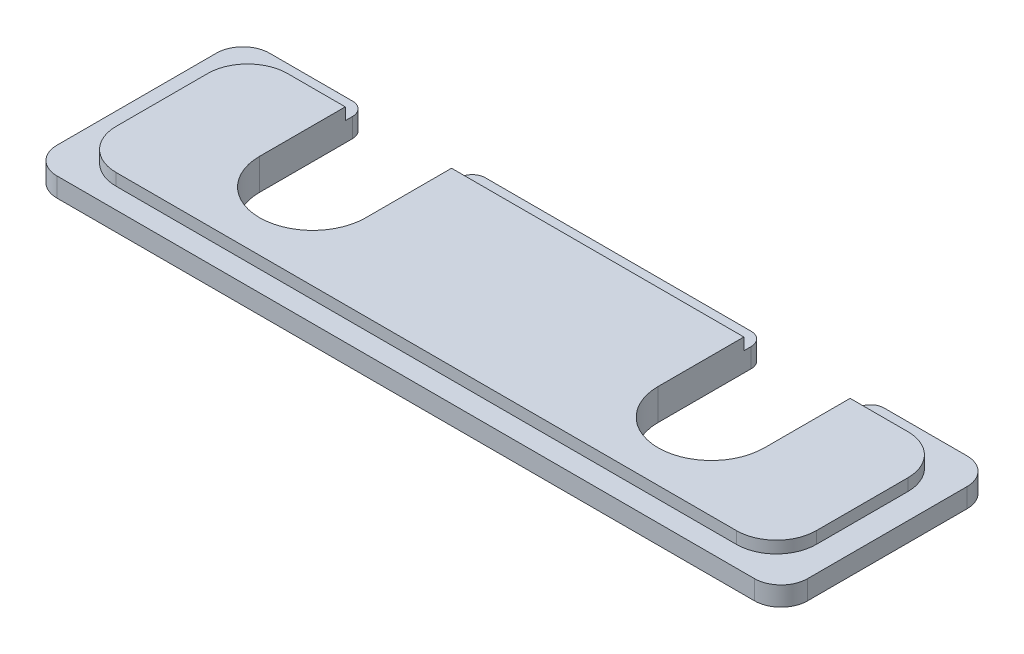
ISO-10303-21;
HEADER;
FILE_DESCRIPTION(('STEP AP214'),'2;1');
FILE_NAME('part.step','',(''),(''),'','','');
FILE_SCHEMA(('AUTOMOTIVE_DESIGN { 1 0 10303 214 1 1 1 1 }'));
ENDSEC;
DATA;
#1=APPLICATION_CONTEXT('core data for automotive mechanical design processes');
#2=APPLICATION_PROTOCOL_DEFINITION('international standard','automotive_design',2000,#1);
#3=PRODUCT_CONTEXT('',#1,'mechanical');
#4=PRODUCT('Part','Part','',(#3));
#5=PRODUCT_RELATED_PRODUCT_CATEGORY('part','',(#4));
#6=PRODUCT_DEFINITION_FORMATION('','',#4);
#7=PRODUCT_DEFINITION_CONTEXT('part definition',#1,'design');
#8=PRODUCT_DEFINITION('design','',#6,#7);
#9=PRODUCT_DEFINITION_SHAPE('','',#8);
#10=(LENGTH_UNIT() NAMED_UNIT(*) SI_UNIT(.MILLI.,.METRE.));
#11=(NAMED_UNIT(*) PLANE_ANGLE_UNIT() SI_UNIT($,.RADIAN.));
#12=(NAMED_UNIT(*) SI_UNIT($,.STERADIAN.) SOLID_ANGLE_UNIT());
#13=UNCERTAINTY_MEASURE_WITH_UNIT(LENGTH_MEASURE(1.E-05),#10,'distance_accuracy_value','');
#14=(GEOMETRIC_REPRESENTATION_CONTEXT(3) GLOBAL_UNCERTAINTY_ASSIGNED_CONTEXT((#13)) GLOBAL_UNIT_ASSIGNED_CONTEXT((#10,
#11,#12)) REPRESENTATION_CONTEXT('',''));
#15=CARTESIAN_POINT('',(0.,0.,0.));
#16=DIRECTION('',(0.,0.,1.));
#17=DIRECTION('',(1.,0.,0.));
#18=AXIS2_PLACEMENT_3D('',#15,#16,#17);
#19=CARTESIAN_POINT('',(26.25,1.45,-6.));
#20=DIRECTION('',(0.,-1.,0.));
#21=DIRECTION('',(0.,0.,-1.));
#22=AXIS2_PLACEMENT_3D('',#19,#20,#21);
#23=PLANE('',#22);
#24=DIRECTION('',(0.,0.,-1.));
#25=VECTOR('',#24,1.);
#26=CARTESIAN_POINT('',(11.,1.45,-6.));
#27=LINE('',#26,#25);
#28=CARTESIAN_POINT('',(11.,1.45,-6.45));
#29=VERTEX_POINT('',#28);
#30=CARTESIAN_POINT('',(11.,1.45,-7.));
#31=VERTEX_POINT('',#30);
#32=EDGE_CURVE('E337',#29,#31,#27,.T.);
#33=ORIENTED_EDGE('',*,*,#32,.T.);
#34=CARTESIAN_POINT('',(10.,1.45,-7.));
#35=DIRECTION('',(0.,-1.,0.));
#36=DIRECTION('',(0.,0.,-1.));
#37=AXIS2_PLACEMENT_3D('',#34,#35,#36);
#38=CIRCLE('',#37,1.);
#39=CARTESIAN_POINT('',(10.,1.45,-8.));
#40=VERTEX_POINT('',#39);
#41=EDGE_CURVE('E559',#31,#40,#38,.F.);
#42=ORIENTED_EDGE('',*,*,#41,.T.);
#43=DIRECTION('',(-1.,0.,0.));
#44=VECTOR('',#43,1.);
#45=CARTESIAN_POINT('',(-26.25,1.45,-8.));
#46=LINE('',#45,#44);
#47=CARTESIAN_POINT('',(-10.,1.45,-8.));
#48=VERTEX_POINT('',#47);
#49=EDGE_CURVE('E447',#40,#48,#46,.T.);
#50=ORIENTED_EDGE('',*,*,#49,.T.);
#51=CARTESIAN_POINT('',(-10.,1.45,-7.));
#52=DIRECTION('',(0.,-1.,0.));
#53=DIRECTION('',(0.,0.,-1.));
#54=AXIS2_PLACEMENT_3D('',#51,#52,#53);
#55=CIRCLE('',#54,1.);
#56=CARTESIAN_POINT('',(-11.,1.45,-7.));
#57=VERTEX_POINT('',#56);
#58=EDGE_CURVE('E54',#48,#57,#55,.F.);
#59=ORIENTED_EDGE('',*,*,#58,.T.);
#60=DIRECTION('',(0.,0.,1.));
#61=VECTOR('',#60,1.);
#62=CARTESIAN_POINT('',(-11.,1.45,-5.99999999999999));
#63=LINE('',#62,#61);
#64=CARTESIAN_POINT('',(-11.,1.45,-6.45));
#65=VERTEX_POINT('',#64);
#66=EDGE_CURVE('E323',#57,#65,#63,.T.);
#67=ORIENTED_EDGE('',*,*,#66,.T.);
#68=DIRECTION('',(-1.,0.,0.));
#69=VECTOR('',#68,1.);
#70=CARTESIAN_POINT('',(-23.35,1.45,-6.45));
#71=LINE('',#70,#69);
#72=EDGE_CURVE('E389',#29,#65,#71,.T.);
#73=ORIENTED_EDGE('',*,*,#72,.F.);
#74=EDGE_LOOP('',(#33,#42,#50,#59,#67,#73));
#75=FACE_BOUND('',#74,.T.);
#76=ADVANCED_FACE('F38',(#75),#23,.F.);
#77=CARTESIAN_POINT('',(-26.25,1.45,-8.));
#78=DIRECTION('',(0.,0.,1.));
#79=DIRECTION('',(1.,0.,0.));
#80=AXIS2_PLACEMENT_3D('',#77,#78,#79);
#81=PLANE('',#80);
#82=ORIENTED_EDGE('',*,*,#49,.F.);
#83=DIRECTION('',(0.,1.,0.));
#84=VECTOR('',#83,1.);
#85=CARTESIAN_POINT('',(10.,1.45,-8.));
#86=LINE('',#85,#84);
#87=CARTESIAN_POINT('',(10.,0.,-8.));
#88=VERTEX_POINT('',#87);
#89=EDGE_CURVE('E565',#40,#88,#86,.F.);
#90=ORIENTED_EDGE('',*,*,#89,.T.);
#91=DIRECTION('',(-1.,0.,0.));
#92=VECTOR('',#91,1.);
#93=CARTESIAN_POINT('',(-26.25,0.,-8.));
#94=LINE('',#93,#92);
#95=CARTESIAN_POINT('',(-10.,0.,-8.));
#96=VERTEX_POINT('',#95);
#97=EDGE_CURVE('E475',#88,#96,#94,.T.);
#98=ORIENTED_EDGE('',*,*,#97,.T.);
#99=DIRECTION('',(0.,1.,0.));
#100=VECTOR('',#99,1.);
#101=CARTESIAN_POINT('',(-10.,1.45,-8.));
#102=LINE('',#101,#100);
#103=EDGE_CURVE('E562',#96,#48,#102,.T.);
#104=ORIENTED_EDGE('',*,*,#103,.T.);
#105=EDGE_LOOP('',(#82,#90,#98,#104));
#106=FACE_BOUND('',#105,.T.);
#107=ADVANCED_FACE('F690',(#106),#81,.F.);
#108=CARTESIAN_POINT('',(26.25,0.,-8.));
#109=VERTEX_POINT('',#108);
#110=CARTESIAN_POINT('',(20.,0.,-8.));
#111=VERTEX_POINT('',#110);
#112=EDGE_CURVE('E470',#109,#111,#94,.T.);
#113=ORIENTED_EDGE('',*,*,#112,.T.);
#114=DIRECTION('',(0.,1.,0.));
#115=VECTOR('',#114,1.);
#116=CARTESIAN_POINT('',(20.,1.45,-8.));
#117=LINE('',#116,#115);
#118=CARTESIAN_POINT('',(20.,1.45,-8.));
#119=VERTEX_POINT('',#118);
#120=EDGE_CURVE('E529',#111,#119,#117,.T.);
#121=ORIENTED_EDGE('',*,*,#120,.T.);
#122=CARTESIAN_POINT('',(26.25,1.45,-8.));
#123=VERTEX_POINT('',#122);
#124=EDGE_CURVE('E442',#123,#119,#46,.T.);
#125=ORIENTED_EDGE('',*,*,#124,.F.);
#126=DIRECTION('',(0.,-1.,0.));
#127=VECTOR('',#126,1.);
#128=CARTESIAN_POINT('',(26.25,1.45,-8.));
#129=LINE('',#128,#127);
#130=EDGE_CURVE('E519',#123,#109,#129,.T.);
#131=ORIENTED_EDGE('',*,*,#130,.T.);
#132=EDGE_LOOP('',(#113,#121,#125,#131));
#133=FACE_BOUND('',#132,.T.);
#134=ADVANCED_FACE('F643',(#133),#81,.F.);
#135=CARTESIAN_POINT('',(-23.35,2.35,-6.45));
#136=DIRECTION('',(0.,0.,1.));
#137=DIRECTION('',(1.,0.,0.));
#138=AXIS2_PLACEMENT_3D('',#135,#136,#137);
#139=PLANE('',#138);
#140=DIRECTION('',(-1.,0.,0.));
#141=VECTOR('',#140,1.);
#142=CARTESIAN_POINT('',(-23.35,2.35,-6.45));
#143=LINE('',#142,#141);
#144=CARTESIAN_POINT('',(11.,2.35,-6.45));
#145=VERTEX_POINT('',#144);
#146=CARTESIAN_POINT('',(-11.,2.35,-6.45));
#147=VERTEX_POINT('',#146);
#148=EDGE_CURVE('E359',#145,#147,#143,.T.);
#149=ORIENTED_EDGE('',*,*,#148,.F.);
#150=DIRECTION('',(0.,-1.,0.));
#151=VECTOR('',#150,1.);
#152=CARTESIAN_POINT('',(11.,2.35,-6.45));
#153=LINE('',#152,#151);
#154=EDGE_CURVE('E333',#145,#29,#153,.T.);
#155=ORIENTED_EDGE('',*,*,#154,.T.);
#156=ORIENTED_EDGE('',*,*,#72,.T.);
#157=DIRECTION('',(0.,1.,0.));
#158=VECTOR('',#157,1.);
#159=CARTESIAN_POINT('',(-11.,2.35,-6.45));
#160=LINE('',#159,#158);
#161=EDGE_CURVE('E319',#65,#147,#160,.T.);
#162=ORIENTED_EDGE('',*,*,#161,.T.);
#163=EDGE_LOOP('',(#149,#155,#156,#162));
#164=FACE_BOUND('',#163,.T.);
#165=ADVANCED_FACE('F592',(#164),#139,.F.);
#166=CARTESIAN_POINT('',(23.35,1.45,-6.45));
#167=VERTEX_POINT('',#166);
#168=CARTESIAN_POINT('',(19.,1.45,-6.45));
#169=VERTEX_POINT('',#168);
#170=EDGE_CURVE('E384',#167,#169,#71,.T.);
#171=ORIENTED_EDGE('',*,*,#170,.T.);
#172=DIRECTION('',(0.,1.,0.));
#173=VECTOR('',#172,1.);
#174=CARTESIAN_POINT('',(19.,2.35,-6.45));
#175=LINE('',#174,#173);
#176=CARTESIAN_POINT('',(19.,2.35,-6.45));
#177=VERTEX_POINT('',#176);
#178=EDGE_CURVE('E326',#169,#177,#175,.T.);
#179=ORIENTED_EDGE('',*,*,#178,.T.);
#180=CARTESIAN_POINT('',(23.35,2.35,-6.45));
#181=VERTEX_POINT('',#180);
#182=EDGE_CURVE('E354',#181,#177,#143,.T.);
#183=ORIENTED_EDGE('',*,*,#182,.F.);
#184=DIRECTION('',(0.,-1.,0.));
#185=VECTOR('',#184,1.);
#186=CARTESIAN_POINT('',(23.35,2.35,-6.45));
#187=LINE('',#186,#185);
#188=EDGE_CURVE('E423',#181,#167,#187,.T.);
#189=ORIENTED_EDGE('',*,*,#188,.T.);
#190=EDGE_LOOP('',(#171,#179,#183,#189));
#191=FACE_BOUND('',#190,.T.);
#192=ADVANCED_FACE('F637',(#191),#139,.F.);
#193=ORIENTED_EDGE('',*,*,#124,.T.);
#194=CARTESIAN_POINT('',(20.,1.45,-7.));
#195=DIRECTION('',(0.,-1.,0.));
#196=DIRECTION('',(0.,0.,-1.));
#197=AXIS2_PLACEMENT_3D('',#194,#195,#196);
#198=CIRCLE('',#197,1.);
#199=CARTESIAN_POINT('',(19.,1.45,-7.));
#200=VERTEX_POINT('',#199);
#201=EDGE_CURVE('E536',#119,#200,#198,.F.);
#202=ORIENTED_EDGE('',*,*,#201,.T.);
#203=DIRECTION('',(0.,0.,1.));
#204=VECTOR('',#203,1.);
#205=CARTESIAN_POINT('',(19.,1.45,-6.));
#206=LINE('',#205,#204);
#207=EDGE_CURVE('E330',#200,#169,#206,.T.);
#208=ORIENTED_EDGE('',*,*,#207,.T.);
#209=ORIENTED_EDGE('',*,*,#170,.F.);
#210=CARTESIAN_POINT('',(23.35,1.45,-3.45));
#211=DIRECTION('',(0.,1.,0.));
#212=DIRECTION('',(0.,0.,-1.));
#213=AXIS2_PLACEMENT_3D('',#210,#211,#212);
#214=CIRCLE('',#213,3.);
#215=CARTESIAN_POINT('',(26.35,1.45,-3.44999999999998));
#216=VERTEX_POINT('',#215);
#217=EDGE_CURVE('E379',#216,#167,#214,.T.);
#218=ORIENTED_EDGE('',*,*,#217,.F.);
#219=DIRECTION('',(0.,0.,-1.));
#220=VECTOR('',#219,1.);
#221=CARTESIAN_POINT('',(26.35,1.45,3.44999999999998));
#222=LINE('',#221,#220);
#223=CARTESIAN_POINT('',(26.35,1.45,3.44999999999998));
#224=VERTEX_POINT('',#223);
#225=EDGE_CURVE('E375',#224,#216,#222,.T.);
#226=ORIENTED_EDGE('',*,*,#225,.F.);
#227=CARTESIAN_POINT('',(23.35,1.45,3.45));
#228=DIRECTION('',(0.,1.,0.));
#229=DIRECTION('',(0.,0.,1.));
#230=AXIS2_PLACEMENT_3D('',#227,#228,#229);
#231=CIRCLE('',#230,3.);
#232=CARTESIAN_POINT('',(23.35,1.45,6.45));
#233=VERTEX_POINT('',#232);
#234=EDGE_CURVE('E341',#233,#224,#231,.T.);
#235=ORIENTED_EDGE('',*,*,#234,.F.);
#236=DIRECTION('',(1.,0.,0.));
#237=VECTOR('',#236,1.);
#238=CARTESIAN_POINT('',(-23.35,1.45,6.45));
#239=LINE('',#238,#237);
#240=CARTESIAN_POINT('',(-23.35,1.45,6.45));
#241=VERTEX_POINT('',#240);
#242=EDGE_CURVE('E347',#241,#233,#239,.T.);
#243=ORIENTED_EDGE('',*,*,#242,.F.);
#244=CARTESIAN_POINT('',(-23.35,1.45,3.45));
#245=DIRECTION('',(0.,1.,0.));
#246=DIRECTION('',(0.,0.,-1.));
#247=AXIS2_PLACEMENT_3D('',#244,#245,#246);
#248=CIRCLE('',#247,3.);
#249=CARTESIAN_POINT('',(-26.35,1.45,3.44999999999998));
#250=VERTEX_POINT('',#249);
#251=EDGE_CURVE('E397',#250,#241,#248,.T.);
#252=ORIENTED_EDGE('',*,*,#251,.F.);
#253=DIRECTION('',(0.,0.,1.));
#254=VECTOR('',#253,1.);
#255=CARTESIAN_POINT('',(-26.35,1.45,3.44999999999998));
#256=LINE('',#255,#254);
#257=CARTESIAN_POINT('',(-26.35,1.45,-3.44999999999998));
#258=VERTEX_POINT('',#257);
#259=EDGE_CURVE('E393',#258,#250,#256,.T.);
#260=ORIENTED_EDGE('',*,*,#259,.F.);
#261=CARTESIAN_POINT('',(-23.35,1.45,-3.45));
#262=DIRECTION('',(0.,1.,0.));
#263=DIRECTION('',(0.,0.,-1.));
#264=AXIS2_PLACEMENT_3D('',#261,#262,#263);
#265=CIRCLE('',#264,3.);
#266=CARTESIAN_POINT('',(-23.35,1.45,-6.45));
#267=VERTEX_POINT('',#266);
#268=EDGE_CURVE('E388',#267,#258,#265,.T.);
#269=ORIENTED_EDGE('',*,*,#268,.F.);
#270=CARTESIAN_POINT('',(-19.,1.45,-6.45));
#271=VERTEX_POINT('',#270);
#272=EDGE_CURVE('E383',#271,#267,#71,.T.);
#273=ORIENTED_EDGE('',*,*,#272,.F.);
#274=DIRECTION('',(0.,0.,-1.));
#275=VECTOR('',#274,1.);
#276=CARTESIAN_POINT('',(-19.,1.45,-6.));
#277=LINE('',#276,#275);
#278=CARTESIAN_POINT('',(-19.,1.45,-7.));
#279=VERTEX_POINT('',#278);
#280=EDGE_CURVE('E315',#271,#279,#277,.T.);
#281=ORIENTED_EDGE('',*,*,#280,.T.);
#282=CARTESIAN_POINT('',(-20.,1.45,-7.));
#283=DIRECTION('',(0.,-1.,0.));
#284=DIRECTION('',(0.,0.,-1.));
#285=AXIS2_PLACEMENT_3D('',#282,#283,#284);
#286=CIRCLE('',#285,1.);
#287=CARTESIAN_POINT('',(-20.,1.45,-8.));
#288=VERTEX_POINT('',#287);
#289=EDGE_CURVE('E533',#279,#288,#286,.F.);
#290=ORIENTED_EDGE('',*,*,#289,.T.);
#291=CARTESIAN_POINT('',(-26.25,1.45,-8.));
#292=VERTEX_POINT('',#291);
#293=EDGE_CURVE('E440',#288,#292,#46,.T.);
#294=ORIENTED_EDGE('',*,*,#293,.T.);
#295=CARTESIAN_POINT('',(-26.25,1.45,-6.));
#296=DIRECTION('',(0.,1.,0.));
#297=DIRECTION('',(0.,0.,-1.));
#298=AXIS2_PLACEMENT_3D('',#295,#296,#297);
#299=CIRCLE('',#298,2.);
#300=CARTESIAN_POINT('',(-28.25,1.45,-6.));
#301=VERTEX_POINT('',#300);
#302=EDGE_CURVE('E446',#292,#301,#299,.T.);
#303=ORIENTED_EDGE('',*,*,#302,.T.);
#304=DIRECTION('',(0.,0.,1.));
#305=VECTOR('',#304,1.);
#306=CARTESIAN_POINT('',(-28.25,1.45,6.));
#307=LINE('',#306,#305);
#308=CARTESIAN_POINT('',(-28.25,1.45,6.));
#309=VERTEX_POINT('',#308);
#310=EDGE_CURVE('E450',#301,#309,#307,.T.);
#311=ORIENTED_EDGE('',*,*,#310,.T.);
#312=CARTESIAN_POINT('',(-26.25,1.45,6.));
#313=DIRECTION('',(0.,1.,0.));
#314=DIRECTION('',(0.,0.,-1.));
#315=AXIS2_PLACEMENT_3D('',#312,#313,#314);
#316=CIRCLE('',#315,2.);
#317=CARTESIAN_POINT('',(-26.25,1.45,8.));
#318=VERTEX_POINT('',#317);
#319=EDGE_CURVE('E453',#309,#318,#316,.T.);
#320=ORIENTED_EDGE('',*,*,#319,.T.);
#321=DIRECTION('',(1.,0.,0.));
#322=VECTOR('',#321,1.);
#323=CARTESIAN_POINT('',(-26.25,1.45,8.));
#324=LINE('',#323,#322);
#325=CARTESIAN_POINT('',(26.25,1.45,8.));
#326=VERTEX_POINT('',#325);
#327=EDGE_CURVE('E456',#318,#326,#324,.T.);
#328=ORIENTED_EDGE('',*,*,#327,.T.);
#329=CARTESIAN_POINT('',(26.25,1.45,6.));
#330=DIRECTION('',(0.,1.,0.));
#331=DIRECTION('',(0.,0.,1.));
#332=AXIS2_PLACEMENT_3D('',#329,#330,#331);
#333=CIRCLE('',#332,2.);
#334=CARTESIAN_POINT('',(28.25,1.45,6.));
#335=VERTEX_POINT('',#334);
#336=EDGE_CURVE('E459',#326,#335,#333,.T.);
#337=ORIENTED_EDGE('',*,*,#336,.T.);
#338=DIRECTION('',(0.,0.,-1.));
#339=VECTOR('',#338,1.);
#340=CARTESIAN_POINT('',(28.25,1.45,6.));
#341=LINE('',#340,#339);
#342=CARTESIAN_POINT('',(28.25,1.45,-6.));
#343=VERTEX_POINT('',#342);
#344=EDGE_CURVE('E462',#335,#343,#341,.T.);
#345=ORIENTED_EDGE('',*,*,#344,.T.);
#346=CARTESIAN_POINT('',(26.25,1.45,-6.));
#347=DIRECTION('',(0.,1.,0.));
#348=DIRECTION('',(0.,0.,-1.));
#349=AXIS2_PLACEMENT_3D('',#346,#347,#348);
#350=CIRCLE('',#349,2.);
#351=EDGE_CURVE('E436',#343,#123,#350,.T.);
#352=ORIENTED_EDGE('',*,*,#351,.T.);
#353=EDGE_LOOP('',(#193,#202,#208,#209,#218,#226,#235,#243,#252,#260,#269,#273,#281,#290,#294,
#303,#311,#320,#328,#337,#345,#352));
#354=FACE_BOUND('',#353,.T.);
#355=ADVANCED_FACE('F581',(#354),#23,.F.);
#356=CARTESIAN_POINT('',(26.25,1.45,-6.));
#357=DIRECTION('',(0.,-1.,0.));
#358=DIRECTION('',(0.,0.,-1.));
#359=AXIS2_PLACEMENT_3D('',#356,#357,#358);
#360=CYLINDRICAL_SURFACE('',#359,2.);
#361=CARTESIAN_POINT('',(26.25,0.,-6.));
#362=DIRECTION('',(0.,1.,0.));
#363=DIRECTION('',(0.,0.,-1.));
#364=AXIS2_PLACEMENT_3D('',#361,#362,#363);
#365=CIRCLE('',#364,2.);
#366=CARTESIAN_POINT('',(28.25,0.,-6.));
#367=VERTEX_POINT('',#366);
#368=EDGE_CURVE('E435',#367,#109,#365,.T.);
#369=ORIENTED_EDGE('',*,*,#368,.T.);
#370=ORIENTED_EDGE('',*,*,#130,.F.);
#371=ORIENTED_EDGE('',*,*,#351,.F.);
#372=DIRECTION('',(0.,-1.,0.));
#373=VECTOR('',#372,1.);
#374=CARTESIAN_POINT('',(28.25,1.45,-6.));
#375=LINE('',#374,#373);
#376=EDGE_CURVE('E465',#343,#367,#375,.T.);
#377=ORIENTED_EDGE('',*,*,#376,.T.);
#378=EDGE_LOOP('',(#369,#370,#371,#377));
#379=FACE_BOUND('',#378,.T.);
#380=ADVANCED_FACE('F649',(#379),#360,.T.);
#381=ORIENTED_EDGE('',*,*,#293,.F.);
#382=DIRECTION('',(0.,1.,0.));
#383=VECTOR('',#382,1.);
#384=CARTESIAN_POINT('',(-20.,1.45,-8.));
#385=LINE('',#384,#383);
#386=CARTESIAN_POINT('',(-20.,0.,-8.));
#387=VERTEX_POINT('',#386);
#388=EDGE_CURVE('E11',#288,#387,#385,.F.);
#389=ORIENTED_EDGE('',*,*,#388,.T.);
#390=CARTESIAN_POINT('',(-26.25,0.,-8.));
#391=VERTEX_POINT('',#390);
#392=EDGE_CURVE('E469',#387,#391,#94,.T.);
#393=ORIENTED_EDGE('',*,*,#392,.T.);
#394=DIRECTION('',(0.,-1.,0.));
#395=VECTOR('',#394,1.);
#396=CARTESIAN_POINT('',(-26.25,1.45,-8.));
#397=LINE('',#396,#395);
#398=EDGE_CURVE('E515',#292,#391,#397,.T.);
#399=ORIENTED_EDGE('',*,*,#398,.F.);
#400=EDGE_LOOP('',(#381,#389,#393,#399));
#401=FACE_BOUND('',#400,.T.);
#402=ADVANCED_FACE('F682',(#401),#81,.F.);
#403=CARTESIAN_POINT('',(-26.25,1.45,-6.));
#404=DIRECTION('',(0.,-1.,0.));
#405=DIRECTION('',(0.,0.,-1.));
#406=AXIS2_PLACEMENT_3D('',#403,#404,#405);
#407=CYLINDRICAL_SURFACE('',#406,2.);
#408=CARTESIAN_POINT('',(-26.25,0.,-6.));
#409=DIRECTION('',(0.,1.,0.));
#410=DIRECTION('',(0.,0.,-1.));
#411=AXIS2_PLACEMENT_3D('',#408,#409,#410);
#412=CIRCLE('',#411,2.);
#413=CARTESIAN_POINT('',(-28.25,0.,-6.));
#414=VERTEX_POINT('',#413);
#415=EDGE_CURVE('E474',#391,#414,#412,.T.);
#416=ORIENTED_EDGE('',*,*,#415,.T.);
#417=DIRECTION('',(0.,-1.,0.));
#418=VECTOR('',#417,1.);
#419=CARTESIAN_POINT('',(-28.25,1.45,-6.));
#420=LINE('',#419,#418);
#421=EDGE_CURVE('E511',#301,#414,#420,.T.);
#422=ORIENTED_EDGE('',*,*,#421,.F.);
#423=ORIENTED_EDGE('',*,*,#302,.F.);
#424=ORIENTED_EDGE('',*,*,#398,.T.);
#425=EDGE_LOOP('',(#416,#422,#423,#424));
#426=FACE_BOUND('',#425,.T.);
#427=ADVANCED_FACE('F678',(#426),#407,.T.);
#428=CARTESIAN_POINT('',(-28.25,1.45,6.));
#429=DIRECTION('',(1.,0.,0.));
#430=DIRECTION('',(0.,0.,-1.));
#431=AXIS2_PLACEMENT_3D('',#428,#429,#430);
#432=PLANE('',#431);
#433=DIRECTION('',(0.,0.,1.));
#434=VECTOR('',#433,1.);
#435=CARTESIAN_POINT('',(-28.25,0.,6.));
#436=LINE('',#435,#434);
#437=CARTESIAN_POINT('',(-28.25,0.,6.));
#438=VERTEX_POINT('',#437);
#439=EDGE_CURVE('E478',#414,#438,#436,.T.);
#440=ORIENTED_EDGE('',*,*,#439,.T.);
#441=DIRECTION('',(0.,-1.,0.));
#442=VECTOR('',#441,1.);
#443=CARTESIAN_POINT('',(-28.25,1.45,6.));
#444=LINE('',#443,#442);
#445=EDGE_CURVE('E507',#309,#438,#444,.T.);
#446=ORIENTED_EDGE('',*,*,#445,.F.);
#447=ORIENTED_EDGE('',*,*,#310,.F.);
#448=ORIENTED_EDGE('',*,*,#421,.T.);
#449=EDGE_LOOP('',(#440,#446,#447,#448));
#450=FACE_BOUND('',#449,.T.);
#451=ADVANCED_FACE('F673',(#450),#432,.F.);
#452=CARTESIAN_POINT('',(-26.25,1.45,6.));
#453=DIRECTION('',(0.,-1.,0.));
#454=DIRECTION('',(0.,0.,-1.));
#455=AXIS2_PLACEMENT_3D('',#452,#453,#454);
#456=CYLINDRICAL_SURFACE('',#455,2.);
#457=CARTESIAN_POINT('',(-26.25,0.,6.));
#458=DIRECTION('',(0.,1.,0.));
#459=DIRECTION('',(0.,0.,-1.));
#460=AXIS2_PLACEMENT_3D('',#457,#458,#459);
#461=CIRCLE('',#460,2.);
#462=CARTESIAN_POINT('',(-26.25,0.,8.));
#463=VERTEX_POINT('',#462);
#464=EDGE_CURVE('E481',#438,#463,#461,.T.);
#465=ORIENTED_EDGE('',*,*,#464,.T.);
#466=DIRECTION('',(0.,-1.,0.));
#467=VECTOR('',#466,1.);
#468=CARTESIAN_POINT('',(-26.25,1.45,8.));
#469=LINE('',#468,#467);
#470=EDGE_CURVE('E503',#318,#463,#469,.T.);
#471=ORIENTED_EDGE('',*,*,#470,.F.);
#472=ORIENTED_EDGE('',*,*,#319,.F.);
#473=ORIENTED_EDGE('',*,*,#445,.T.);
#474=EDGE_LOOP('',(#465,#471,#472,#473));
#475=FACE_BOUND('',#474,.T.);
#476=ADVANCED_FACE('F669',(#475),#456,.T.);
#477=CARTESIAN_POINT('',(-26.25,1.45,8.));
#478=DIRECTION('',(0.,0.,-1.));
#479=DIRECTION('',(-1.,0.,0.));
#480=AXIS2_PLACEMENT_3D('',#477,#478,#479);
#481=PLANE('',#480);
#482=DIRECTION('',(1.,0.,0.));
#483=VECTOR('',#482,1.);
#484=CARTESIAN_POINT('',(-26.25,0.,8.));
#485=LINE('',#484,#483);
#486=CARTESIAN_POINT('',(26.25,0.,8.));
#487=VERTEX_POINT('',#486);
#488=EDGE_CURVE('E484',#463,#487,#485,.T.);
#489=ORIENTED_EDGE('',*,*,#488,.T.);
#490=DIRECTION('',(0.,-1.,0.));
#491=VECTOR('',#490,1.);
#492=CARTESIAN_POINT('',(26.25,1.45,8.));
#493=LINE('',#492,#491);
#494=EDGE_CURVE('E499',#326,#487,#493,.T.);
#495=ORIENTED_EDGE('',*,*,#494,.F.);
#496=ORIENTED_EDGE('',*,*,#327,.F.);
#497=ORIENTED_EDGE('',*,*,#470,.T.);
#498=EDGE_LOOP('',(#489,#495,#496,#497));
#499=FACE_BOUND('',#498,.T.);
#500=ADVANCED_FACE('F664',(#499),#481,.F.);
#501=CARTESIAN_POINT('',(26.25,1.45,6.));
#502=DIRECTION('',(0.,-1.,0.));
#503=DIRECTION('',(0.,0.,-1.));
#504=AXIS2_PLACEMENT_3D('',#501,#502,#503);
#505=CYLINDRICAL_SURFACE('',#504,2.);
#506=CARTESIAN_POINT('',(26.25,0.,6.));
#507=DIRECTION('',(0.,1.,0.));
#508=DIRECTION('',(0.,0.,1.));
#509=AXIS2_PLACEMENT_3D('',#506,#507,#508);
#510=CIRCLE('',#509,2.);
#511=CARTESIAN_POINT('',(28.25,0.,6.));
#512=VERTEX_POINT('',#511);
#513=EDGE_CURVE('E487',#487,#512,#510,.T.);
#514=ORIENTED_EDGE('',*,*,#513,.T.);
#515=DIRECTION('',(0.,-1.,0.));
#516=VECTOR('',#515,1.);
#517=CARTESIAN_POINT('',(28.25,1.45,6.));
#518=LINE('',#517,#516);
#519=EDGE_CURVE('E495',#335,#512,#518,.T.);
#520=ORIENTED_EDGE('',*,*,#519,.F.);
#521=ORIENTED_EDGE('',*,*,#336,.F.);
#522=ORIENTED_EDGE('',*,*,#494,.T.);
#523=EDGE_LOOP('',(#514,#520,#521,#522));
#524=FACE_BOUND('',#523,.T.);
#525=ADVANCED_FACE('F658',(#524),#505,.T.);
#526=CARTESIAN_POINT('',(28.25,1.45,6.));
#527=DIRECTION('',(-1.,0.,0.));
#528=DIRECTION('',(0.,0.,1.));
#529=AXIS2_PLACEMENT_3D('',#526,#527,#528);
#530=PLANE('',#529);
#531=DIRECTION('',(0.,0.,-1.));
#532=VECTOR('',#531,1.);
#533=CARTESIAN_POINT('',(28.25,0.,6.));
#534=LINE('',#533,#532);
#535=EDGE_CURVE('E441',#512,#367,#534,.T.);
#536=ORIENTED_EDGE('',*,*,#535,.T.);
#537=ORIENTED_EDGE('',*,*,#376,.F.);
#538=ORIENTED_EDGE('',*,*,#344,.F.);
#539=ORIENTED_EDGE('',*,*,#519,.T.);
#540=EDGE_LOOP('',(#536,#537,#538,#539));
#541=FACE_BOUND('',#540,.T.);
#542=ADVANCED_FACE('F654',(#541),#530,.F.);
#543=CARTESIAN_POINT('',(26.25,0.,-6.));
#544=DIRECTION('',(0.,-1.,0.));
#545=DIRECTION('',(0.,0.,-1.));
#546=AXIS2_PLACEMENT_3D('',#543,#544,#545);
#547=PLANE('',#546);
#548=DIRECTION('',(0.,0.,-1.));
#549=VECTOR('',#548,1.);
#550=CARTESIAN_POINT('',(19.,0.,-8.));
#551=LINE('',#550,#549);
#552=CARTESIAN_POINT('',(19.,0.,0.));
#553=VERTEX_POINT('',#552);
#554=CARTESIAN_POINT('',(19.,0.,-7.));
#555=VERTEX_POINT('',#554);
#556=EDGE_CURVE('E262',#553,#555,#551,.T.);
#557=ORIENTED_EDGE('',*,*,#556,.T.);
#558=CARTESIAN_POINT('',(20.,0.,-7.));
#559=DIRECTION('',(0.,-1.,0.));
#560=DIRECTION('',(0.,0.,-1.));
#561=AXIS2_PLACEMENT_3D('',#558,#559,#560);
#562=CIRCLE('',#561,1.);
#563=EDGE_CURVE('E550',#555,#111,#562,.T.);
#564=ORIENTED_EDGE('',*,*,#563,.T.);
#565=ORIENTED_EDGE('',*,*,#112,.F.);
#566=ORIENTED_EDGE('',*,*,#368,.F.);
#567=ORIENTED_EDGE('',*,*,#535,.F.);
#568=ORIENTED_EDGE('',*,*,#513,.F.);
#569=ORIENTED_EDGE('',*,*,#488,.F.);
#570=ORIENTED_EDGE('',*,*,#464,.F.);
#571=ORIENTED_EDGE('',*,*,#439,.F.);
#572=ORIENTED_EDGE('',*,*,#415,.F.);
#573=ORIENTED_EDGE('',*,*,#392,.F.);
#574=CARTESIAN_POINT('',(-20.,0.,-7.));
#575=DIRECTION('',(0.,-1.,0.));
#576=DIRECTION('',(0.,0.,-1.));
#577=AXIS2_PLACEMENT_3D('',#574,#575,#576);
#578=CIRCLE('',#577,1.);
#579=CARTESIAN_POINT('',(-19.,0.,-7.));
#580=VERTEX_POINT('',#579);
#581=EDGE_CURVE('E541',#387,#580,#578,.T.);
#582=ORIENTED_EDGE('',*,*,#581,.T.);
#583=DIRECTION('',(0.,0.,1.));
#584=VECTOR('',#583,1.);
#585=CARTESIAN_POINT('',(-19.,0.,0.));
#586=LINE('',#585,#584);
#587=CARTESIAN_POINT('',(-19.,0.,0.));
#588=VERTEX_POINT('',#587);
#589=EDGE_CURVE('E292',#580,#588,#586,.T.);
#590=ORIENTED_EDGE('',*,*,#589,.T.);
#591=CARTESIAN_POINT('',(-15.,0.,0.));
#592=DIRECTION('',(0.,1.,0.));
#593=DIRECTION('',(0.,0.,1.));
#594=AXIS2_PLACEMENT_3D('',#591,#592,#593);
#595=CIRCLE('',#594,4.);
#596=CARTESIAN_POINT('',(-11.,0.,0.));
#597=VERTEX_POINT('',#596);
#598=EDGE_CURVE('E296',#588,#597,#595,.T.);
#599=ORIENTED_EDGE('',*,*,#598,.T.);
#600=DIRECTION('',(0.,0.,-1.));
#601=VECTOR('',#600,1.);
#602=CARTESIAN_POINT('',(-11.,0.,-8.));
#603=LINE('',#602,#601);
#604=CARTESIAN_POINT('',(-11.,0.,-7.));
#605=VERTEX_POINT('',#604);
#606=EDGE_CURVE('E288',#597,#605,#603,.T.);
#607=ORIENTED_EDGE('',*,*,#606,.T.);
#608=CARTESIAN_POINT('',(-10.,0.,-7.));
#609=DIRECTION('',(0.,-1.,0.));
#610=DIRECTION('',(0.,0.,-1.));
#611=AXIS2_PLACEMENT_3D('',#608,#609,#610);
#612=CIRCLE('',#611,1.);
#613=EDGE_CURVE('E544',#605,#96,#612,.T.);
#614=ORIENTED_EDGE('',*,*,#613,.T.);
#615=ORIENTED_EDGE('',*,*,#97,.F.);
#616=CARTESIAN_POINT('',(10.,0.,-7.));
#617=DIRECTION('',(0.,-1.,0.));
#618=DIRECTION('',(0.,0.,-1.));
#619=AXIS2_PLACEMENT_3D('',#616,#617,#618);
#620=CIRCLE('',#619,1.);
#621=CARTESIAN_POINT('',(11.,0.,-7.));
#622=VERTEX_POINT('',#621);
#623=EDGE_CURVE('E547',#88,#622,#620,.T.);
#624=ORIENTED_EDGE('',*,*,#623,.T.);
#625=DIRECTION('',(0.,0.,1.));
#626=VECTOR('',#625,1.);
#627=CARTESIAN_POINT('',(11.,0.,0.));
#628=LINE('',#627,#626);
#629=CARTESIAN_POINT('',(11.,0.,0.));
#630=VERTEX_POINT('',#629);
#631=EDGE_CURVE('E259',#622,#630,#628,.T.);
#632=ORIENTED_EDGE('',*,*,#631,.T.);
#633=CARTESIAN_POINT('',(15.,0.,0.));
#634=DIRECTION('',(0.,1.,0.));
#635=DIRECTION('',(0.,0.,1.));
#636=AXIS2_PLACEMENT_3D('',#633,#634,#635);
#637=CIRCLE('',#636,4.);
#638=EDGE_CURVE('E252',#630,#553,#637,.T.);
#639=ORIENTED_EDGE('',*,*,#638,.T.);
#640=EDGE_LOOP('',(#557,#564,#565,#566,#567,#568,#569,#570,#571,#572,#573,#582,#590,#599,#607,
#614,#615,#624,#632,#639));
#641=FACE_BOUND('',#640,.T.);
#642=ADVANCED_FACE('F271',(#641),#547,.T.);
#643=CARTESIAN_POINT('',(23.35,2.35,3.45));
#644=DIRECTION('',(0.,-1.,0.));
#645=DIRECTION('',(0.,0.,-1.));
#646=AXIS2_PLACEMENT_3D('',#643,#644,#645);
#647=CYLINDRICAL_SURFACE('',#646,3.);
#648=ORIENTED_EDGE('',*,*,#234,.T.);
#649=DIRECTION('',(0.,-1.,0.));
#650=VECTOR('',#649,1.);
#651=CARTESIAN_POINT('',(26.35,2.35,3.44999999999998));
#652=LINE('',#651,#650);
#653=CARTESIAN_POINT('',(26.35,2.35,3.44999999999998));
#654=VERTEX_POINT('',#653);
#655=EDGE_CURVE('E431',#654,#224,#652,.T.);
#656=ORIENTED_EDGE('',*,*,#655,.F.);
#657=CARTESIAN_POINT('',(23.35,2.35,3.45));
#658=DIRECTION('',(0.,1.,0.));
#659=DIRECTION('',(0.,0.,1.));
#660=AXIS2_PLACEMENT_3D('',#657,#658,#659);
#661=CIRCLE('',#660,3.);
#662=CARTESIAN_POINT('',(23.35,2.35,6.45));
#663=VERTEX_POINT('',#662);
#664=EDGE_CURVE('E342',#663,#654,#661,.T.);
#665=ORIENTED_EDGE('',*,*,#664,.F.);
#666=DIRECTION('',(0.,-1.,0.));
#667=VECTOR('',#666,1.);
#668=CARTESIAN_POINT('',(23.35,2.35,6.45));
#669=LINE('',#668,#667);
#670=EDGE_CURVE('E371',#663,#233,#669,.T.);
#671=ORIENTED_EDGE('',*,*,#670,.T.);
#672=EDGE_LOOP('',(#648,#656,#665,#671));
#673=FACE_BOUND('',#672,.T.);
#674=ADVANCED_FACE('F627',(#673),#647,.T.);
#675=CARTESIAN_POINT('',(26.35,2.35,3.44999999999998));
#676=DIRECTION('',(-1.,0.,0.));
#677=DIRECTION('',(0.,0.,1.));
#678=AXIS2_PLACEMENT_3D('',#675,#676,#677);
#679=PLANE('',#678);
#680=ORIENTED_EDGE('',*,*,#225,.T.);
#681=DIRECTION('',(0.,-1.,0.));
#682=VECTOR('',#681,1.);
#683=CARTESIAN_POINT('',(26.35,2.35,-3.44999999999998));
#684=LINE('',#683,#682);
#685=CARTESIAN_POINT('',(26.35,2.35,-3.44999999999998));
#686=VERTEX_POINT('',#685);
#687=EDGE_CURVE('E427',#686,#216,#684,.T.);
#688=ORIENTED_EDGE('',*,*,#687,.F.);
#689=DIRECTION('',(0.,0.,-1.));
#690=VECTOR('',#689,1.);
#691=CARTESIAN_POINT('',(26.35,2.35,3.44999999999998));
#692=LINE('',#691,#690);
#693=EDGE_CURVE('E346',#654,#686,#692,.T.);
#694=ORIENTED_EDGE('',*,*,#693,.F.);
#695=ORIENTED_EDGE('',*,*,#655,.T.);
#696=EDGE_LOOP('',(#680,#688,#694,#695));
#697=FACE_BOUND('',#696,.T.);
#698=ADVANCED_FACE('F632',(#697),#679,.F.);
#699=CARTESIAN_POINT('',(23.35,2.35,-3.45));
#700=DIRECTION('',(0.,-1.,0.));
#701=DIRECTION('',(0.,0.,-1.));
#702=AXIS2_PLACEMENT_3D('',#699,#700,#701);
#703=CYLINDRICAL_SURFACE('',#702,3.);
#704=ORIENTED_EDGE('',*,*,#217,.T.);
#705=ORIENTED_EDGE('',*,*,#188,.F.);
#706=CARTESIAN_POINT('',(23.35,2.35,-3.45));
#707=DIRECTION('',(0.,1.,0.));
#708=DIRECTION('',(0.,0.,-1.));
#709=AXIS2_PLACEMENT_3D('',#706,#707,#708);
#710=CIRCLE('',#709,3.);
#711=EDGE_CURVE('E350',#686,#181,#710,.T.);
#712=ORIENTED_EDGE('',*,*,#711,.F.);
#713=ORIENTED_EDGE('',*,*,#687,.T.);
#714=EDGE_LOOP('',(#704,#705,#712,#713));
#715=FACE_BOUND('',#714,.T.);
#716=ADVANCED_FACE('F634',(#715),#703,.T.);
#717=CARTESIAN_POINT('',(-19.,2.35,-6.45));
#718=VERTEX_POINT('',#717);
#719=CARTESIAN_POINT('',(-23.35,2.35,-6.45));
#720=VERTEX_POINT('',#719);
#721=EDGE_CURVE('E353',#718,#720,#143,.T.);
#722=ORIENTED_EDGE('',*,*,#721,.F.);
#723=DIRECTION('',(0.,-1.,0.));
#724=VECTOR('',#723,1.);
#725=CARTESIAN_POINT('',(-19.,2.35,-6.45));
#726=LINE('',#725,#724);
#727=EDGE_CURVE('E286',#718,#271,#726,.T.);
#728=ORIENTED_EDGE('',*,*,#727,.T.);
#729=ORIENTED_EDGE('',*,*,#272,.T.);
#730=DIRECTION('',(0.,-1.,0.));
#731=VECTOR('',#730,1.);
#732=CARTESIAN_POINT('',(-23.35,2.35,-6.45));
#733=LINE('',#732,#731);
#734=EDGE_CURVE('E419',#720,#267,#733,.T.);
#735=ORIENTED_EDGE('',*,*,#734,.F.);
#736=EDGE_LOOP('',(#722,#728,#729,#735));
#737=FACE_BOUND('',#736,.T.);
#738=ADVANCED_FACE('F609',(#737),#139,.F.);
#739=CARTESIAN_POINT('',(-23.35,2.35,-3.45));
#740=DIRECTION('',(0.,-1.,0.));
#741=DIRECTION('',(0.,0.,-1.));
#742=AXIS2_PLACEMENT_3D('',#739,#740,#741);
#743=CYLINDRICAL_SURFACE('',#742,3.);
#744=ORIENTED_EDGE('',*,*,#268,.T.);
#745=DIRECTION('',(0.,-1.,0.));
#746=VECTOR('',#745,1.);
#747=CARTESIAN_POINT('',(-26.35,2.35,-3.44999999999998));
#748=LINE('',#747,#746);
#749=CARTESIAN_POINT('',(-26.35,2.35,-3.44999999999998));
#750=VERTEX_POINT('',#749);
#751=EDGE_CURVE('E415',#750,#258,#748,.T.);
#752=ORIENTED_EDGE('',*,*,#751,.F.);
#753=CARTESIAN_POINT('',(-23.35,2.35,-3.45));
#754=DIRECTION('',(0.,1.,0.));
#755=DIRECTION('',(0.,0.,-1.));
#756=AXIS2_PLACEMENT_3D('',#753,#754,#755);
#757=CIRCLE('',#756,3.);
#758=EDGE_CURVE('E358',#720,#750,#757,.T.);
#759=ORIENTED_EDGE('',*,*,#758,.F.);
#760=ORIENTED_EDGE('',*,*,#734,.T.);
#761=EDGE_LOOP('',(#744,#752,#759,#760));
#762=FACE_BOUND('',#761,.T.);
#763=ADVANCED_FACE('F611',(#762),#743,.T.);
#764=CARTESIAN_POINT('',(-26.35,2.35,3.44999999999998));
#765=DIRECTION('',(1.,0.,0.));
#766=DIRECTION('',(0.,0.,-1.));
#767=AXIS2_PLACEMENT_3D('',#764,#765,#766);
#768=PLANE('',#767);
#769=ORIENTED_EDGE('',*,*,#259,.T.);
#770=DIRECTION('',(0.,-1.,0.));
#771=VECTOR('',#770,1.);
#772=CARTESIAN_POINT('',(-26.35,2.35,3.44999999999998));
#773=LINE('',#772,#771);
#774=CARTESIAN_POINT('',(-26.35,2.35,3.44999999999998));
#775=VERTEX_POINT('',#774);
#776=EDGE_CURVE('E411',#775,#250,#773,.T.);
#777=ORIENTED_EDGE('',*,*,#776,.F.);
#778=DIRECTION('',(0.,0.,1.));
#779=VECTOR('',#778,1.);
#780=CARTESIAN_POINT('',(-26.35,2.35,3.44999999999998));
#781=LINE('',#780,#779);
#782=EDGE_CURVE('E362',#750,#775,#781,.T.);
#783=ORIENTED_EDGE('',*,*,#782,.F.);
#784=ORIENTED_EDGE('',*,*,#751,.T.);
#785=EDGE_LOOP('',(#769,#777,#783,#784));
#786=FACE_BOUND('',#785,.T.);
#787=ADVANCED_FACE('F615',(#786),#768,.F.);
#788=CARTESIAN_POINT('',(-23.35,2.35,3.45));
#789=DIRECTION('',(0.,-1.,0.));
#790=DIRECTION('',(0.,0.,-1.));
#791=AXIS2_PLACEMENT_3D('',#788,#789,#790);
#792=CYLINDRICAL_SURFACE('',#791,3.);
#793=ORIENTED_EDGE('',*,*,#251,.T.);
#794=DIRECTION('',(0.,-1.,0.));
#795=VECTOR('',#794,1.);
#796=CARTESIAN_POINT('',(-23.35,2.35,6.45));
#797=LINE('',#796,#795);
#798=CARTESIAN_POINT('',(-23.35,2.35,6.45));
#799=VERTEX_POINT('',#798);
#800=EDGE_CURVE('E407',#799,#241,#797,.T.);
#801=ORIENTED_EDGE('',*,*,#800,.F.);
#802=CARTESIAN_POINT('',(-23.35,2.35,3.45));
#803=DIRECTION('',(0.,1.,0.));
#804=DIRECTION('',(0.,0.,-1.));
#805=AXIS2_PLACEMENT_3D('',#802,#803,#804);
#806=CIRCLE('',#805,3.);
#807=EDGE_CURVE('E365',#775,#799,#806,.T.);
#808=ORIENTED_EDGE('',*,*,#807,.F.);
#809=ORIENTED_EDGE('',*,*,#776,.T.);
#810=EDGE_LOOP('',(#793,#801,#808,#809));
#811=FACE_BOUND('',#810,.T.);
#812=ADVANCED_FACE('F621',(#811),#792,.T.);
#813=CARTESIAN_POINT('',(-23.35,2.35,6.45));
#814=DIRECTION('',(0.,0.,-1.));
#815=DIRECTION('',(-1.,0.,0.));
#816=AXIS2_PLACEMENT_3D('',#813,#814,#815);
#817=PLANE('',#816);
#818=ORIENTED_EDGE('',*,*,#242,.T.);
#819=ORIENTED_EDGE('',*,*,#670,.F.);
#820=DIRECTION('',(1.,0.,0.));
#821=VECTOR('',#820,1.);
#822=CARTESIAN_POINT('',(-23.35,2.35,6.45));
#823=LINE('',#822,#821);
#824=EDGE_CURVE('E368',#799,#663,#823,.T.);
#825=ORIENTED_EDGE('',*,*,#824,.F.);
#826=ORIENTED_EDGE('',*,*,#800,.T.);
#827=EDGE_LOOP('',(#818,#819,#825,#826));
#828=FACE_BOUND('',#827,.T.);
#829=ADVANCED_FACE('F623',(#828),#817,.F.);
#830=CARTESIAN_POINT('',(23.35,2.35,3.45));
#831=DIRECTION('',(0.,1.,0.));
#832=DIRECTION('',(0.,0.,1.));
#833=AXIS2_PLACEMENT_3D('',#830,#831,#832);
#834=PLANE('',#833);
#835=DIRECTION('',(0.,0.,1.));
#836=VECTOR('',#835,1.);
#837=CARTESIAN_POINT('',(11.,2.35,3.45));
#838=LINE('',#837,#836);
#839=CARTESIAN_POINT('',(11.,2.35,0.));
#840=VERTEX_POINT('',#839);
#841=EDGE_CURVE('E526',#145,#840,#838,.T.);
#842=ORIENTED_EDGE('',*,*,#841,.F.);
#843=ORIENTED_EDGE('',*,*,#148,.T.);
#844=DIRECTION('',(0.,0.,-1.));
#845=VECTOR('',#844,1.);
#846=CARTESIAN_POINT('',(-11.,2.35,-8.));
#847=LINE('',#846,#845);
#848=CARTESIAN_POINT('',(-11.,2.35,0.));
#849=VERTEX_POINT('',#848);
#850=EDGE_CURVE('E301',#849,#147,#847,.T.);
#851=ORIENTED_EDGE('',*,*,#850,.F.);
#852=CARTESIAN_POINT('',(-15.,2.35,0.));
#853=DIRECTION('',(0.,1.,0.));
#854=DIRECTION('',(0.,0.,1.));
#855=AXIS2_PLACEMENT_3D('',#852,#853,#854);
#856=CIRCLE('',#855,4.);
#857=CARTESIAN_POINT('',(-19.,2.35,0.));
#858=VERTEX_POINT('',#857);
#859=EDGE_CURVE('E293',#858,#849,#856,.T.);
#860=ORIENTED_EDGE('',*,*,#859,.F.);
#861=DIRECTION('',(0.,0.,1.));
#862=VECTOR('',#861,1.);
#863=CARTESIAN_POINT('',(-19.,2.35,3.45));
#864=LINE('',#863,#862);
#865=EDGE_CURVE('E523',#718,#858,#864,.T.);
#866=ORIENTED_EDGE('',*,*,#865,.F.);
#867=ORIENTED_EDGE('',*,*,#721,.T.);
#868=ORIENTED_EDGE('',*,*,#758,.T.);
#869=ORIENTED_EDGE('',*,*,#782,.T.);
#870=ORIENTED_EDGE('',*,*,#807,.T.);
#871=ORIENTED_EDGE('',*,*,#824,.T.);
#872=ORIENTED_EDGE('',*,*,#664,.T.);
#873=ORIENTED_EDGE('',*,*,#693,.T.);
#874=ORIENTED_EDGE('',*,*,#711,.T.);
#875=ORIENTED_EDGE('',*,*,#182,.T.);
#876=DIRECTION('',(0.,0.,-1.));
#877=VECTOR('',#876,1.);
#878=CARTESIAN_POINT('',(19.,2.35,-8.));
#879=LINE('',#878,#877);
#880=CARTESIAN_POINT('',(19.,2.35,0.));
#881=VERTEX_POINT('',#880);
#882=EDGE_CURVE('E275',#881,#177,#879,.T.);
#883=ORIENTED_EDGE('',*,*,#882,.F.);
#884=CARTESIAN_POINT('',(15.,2.35,0.));
#885=DIRECTION('',(0.,1.,0.));
#886=DIRECTION('',(0.,0.,1.));
#887=AXIS2_PLACEMENT_3D('',#884,#885,#886);
#888=CIRCLE('',#887,4.);
#889=EDGE_CURVE('E254',#840,#881,#888,.T.);
#890=ORIENTED_EDGE('',*,*,#889,.F.);
#891=EDGE_LOOP('',(#842,#843,#851,#860,#866,#867,#868,#869,#870,#871,#872,#873,#874,#875,#883,#890));
#892=FACE_BOUND('',#891,.T.);
#893=ADVANCED_FACE('F602',(#892),#834,.T.);
#894=CARTESIAN_POINT('',(-11.,0.,-8.));
#895=DIRECTION('',(1.,0.,0.));
#896=DIRECTION('',(0.,0.,-1.));
#897=AXIS2_PLACEMENT_3D('',#894,#895,#896);
#898=PLANE('',#897);
#899=ORIENTED_EDGE('',*,*,#66,.F.);
#900=DIRECTION('',(0.,1.,0.));
#901=VECTOR('',#900,1.);
#902=CARTESIAN_POINT('',(-11.,0.,-7.));
#903=LINE('',#902,#901);
#904=EDGE_CURVE('E568',#57,#605,#903,.F.);
#905=ORIENTED_EDGE('',*,*,#904,.T.);
#906=ORIENTED_EDGE('',*,*,#606,.F.);
#907=DIRECTION('',(0.,1.,0.));
#908=VECTOR('',#907,1.);
#909=CARTESIAN_POINT('',(-11.,0.,0.));
#910=LINE('',#909,#908);
#911=EDGE_CURVE('E283',#597,#849,#910,.T.);
#912=ORIENTED_EDGE('',*,*,#911,.T.);
#913=ORIENTED_EDGE('',*,*,#850,.T.);
#914=ORIENTED_EDGE('',*,*,#161,.F.);
#915=EDGE_LOOP('',(#899,#905,#906,#912,#913,#914));
#916=FACE_BOUND('',#915,.T.);
#917=ADVANCED_FACE('F596',(#916),#898,.F.);
#918=CARTESIAN_POINT('',(-19.,0.,0.));
#919=DIRECTION('',(-1.,0.,0.));
#920=DIRECTION('',(0.,0.,1.));
#921=AXIS2_PLACEMENT_3D('',#918,#919,#920);
#922=PLANE('',#921);
#923=ORIENTED_EDGE('',*,*,#589,.F.);
#924=DIRECTION('',(0.,1.,0.));
#925=VECTOR('',#924,1.);
#926=CARTESIAN_POINT('',(-19.,0.,-7.));
#927=LINE('',#926,#925);
#928=EDGE_CURVE('E47',#580,#279,#927,.T.);
#929=ORIENTED_EDGE('',*,*,#928,.T.);
#930=ORIENTED_EDGE('',*,*,#280,.F.);
#931=ORIENTED_EDGE('',*,*,#727,.F.);
#932=ORIENTED_EDGE('',*,*,#865,.T.);
#933=DIRECTION('',(0.,1.,0.));
#934=VECTOR('',#933,1.);
#935=CARTESIAN_POINT('',(-19.,0.,0.));
#936=LINE('',#935,#934);
#937=EDGE_CURVE('E300',#588,#858,#936,.T.);
#938=ORIENTED_EDGE('',*,*,#937,.F.);
#939=EDGE_LOOP('',(#923,#929,#930,#931,#932,#938));
#940=FACE_BOUND('',#939,.T.);
#941=ADVANCED_FACE('F575',(#940),#922,.F.);
#942=CARTESIAN_POINT('',(-15.,0.,0.));
#943=DIRECTION('',(0.,1.,0.));
#944=DIRECTION('',(0.,0.,1.));
#945=AXIS2_PLACEMENT_3D('',#942,#943,#944);
#946=CYLINDRICAL_SURFACE('',#945,4.);
#947=ORIENTED_EDGE('',*,*,#859,.T.);
#948=ORIENTED_EDGE('',*,*,#911,.F.);
#949=ORIENTED_EDGE('',*,*,#598,.F.);
#950=ORIENTED_EDGE('',*,*,#937,.T.);
#951=EDGE_LOOP('',(#947,#948,#949,#950));
#952=FACE_BOUND('',#951,.T.);
#953=ADVANCED_FACE('F697',(#952),#946,.F.);
#954=CARTESIAN_POINT('',(11.,0.,0.));
#955=DIRECTION('',(-1.,0.,0.));
#956=DIRECTION('',(0.,0.,1.));
#957=AXIS2_PLACEMENT_3D('',#954,#955,#956);
#958=PLANE('',#957);
#959=ORIENTED_EDGE('',*,*,#631,.F.);
#960=DIRECTION('',(0.,1.,0.));
#961=VECTOR('',#960,1.);
#962=CARTESIAN_POINT('',(11.,0.,-7.));
#963=LINE('',#962,#961);
#964=EDGE_CURVE('E553',#622,#31,#963,.T.);
#965=ORIENTED_EDGE('',*,*,#964,.T.);
#966=ORIENTED_EDGE('',*,*,#32,.F.);
#967=ORIENTED_EDGE('',*,*,#154,.F.);
#968=ORIENTED_EDGE('',*,*,#841,.T.);
#969=DIRECTION('',(0.,1.,0.));
#970=VECTOR('',#969,1.);
#971=CARTESIAN_POINT('',(11.,0.,0.));
#972=LINE('',#971,#970);
#973=EDGE_CURVE('E258',#630,#840,#972,.T.);
#974=ORIENTED_EDGE('',*,*,#973,.F.);
#975=EDGE_LOOP('',(#959,#965,#966,#967,#968,#974));
#976=FACE_BOUND('',#975,.T.);
#977=ADVANCED_FACE('F699',(#976),#958,.F.);
#978=CARTESIAN_POINT('',(19.,0.,-8.));
#979=DIRECTION('',(1.,0.,0.));
#980=DIRECTION('',(0.,0.,-1.));
#981=AXIS2_PLACEMENT_3D('',#978,#979,#980);
#982=PLANE('',#981);
#983=ORIENTED_EDGE('',*,*,#207,.F.);
#984=DIRECTION('',(0.,1.,0.));
#985=VECTOR('',#984,1.);
#986=CARTESIAN_POINT('',(19.,0.,-7.));
#987=LINE('',#986,#985);
#988=EDGE_CURVE('E266',#200,#555,#987,.F.);
#989=ORIENTED_EDGE('',*,*,#988,.T.);
#990=ORIENTED_EDGE('',*,*,#556,.F.);
#991=DIRECTION('',(0.,1.,0.));
#992=VECTOR('',#991,1.);
#993=CARTESIAN_POINT('',(19.,0.,0.));
#994=LINE('',#993,#992);
#995=EDGE_CURVE('E247',#553,#881,#994,.T.);
#996=ORIENTED_EDGE('',*,*,#995,.T.);
#997=ORIENTED_EDGE('',*,*,#882,.T.);
#998=ORIENTED_EDGE('',*,*,#178,.F.);
#999=EDGE_LOOP('',(#983,#989,#990,#996,#997,#998));
#1000=FACE_BOUND('',#999,.T.);
#1001=ADVANCED_FACE('F264',(#1000),#982,.F.);
#1002=CARTESIAN_POINT('',(15.,0.,0.));
#1003=DIRECTION('',(0.,1.,0.));
#1004=DIRECTION('',(0.,0.,1.));
#1005=AXIS2_PLACEMENT_3D('',#1002,#1003,#1004);
#1006=CYLINDRICAL_SURFACE('',#1005,4.);
#1007=ORIENTED_EDGE('',*,*,#889,.T.);
#1008=ORIENTED_EDGE('',*,*,#995,.F.);
#1009=ORIENTED_EDGE('',*,*,#638,.F.);
#1010=ORIENTED_EDGE('',*,*,#973,.T.);
#1011=EDGE_LOOP('',(#1007,#1008,#1009,#1010));
#1012=FACE_BOUND('',#1011,.T.);
#1013=ADVANCED_FACE('F249',(#1012),#1006,.F.);
#1014=CARTESIAN_POINT('',(20.,1.45,-7.));
#1015=DIRECTION('',(0.,1.,0.));
#1016=DIRECTION('',(0.,0.,1.));
#1017=AXIS2_PLACEMENT_3D('',#1014,#1015,#1016);
#1018=CYLINDRICAL_SURFACE('',#1017,1.);
#1019=ORIENTED_EDGE('',*,*,#563,.F.);
#1020=ORIENTED_EDGE('',*,*,#988,.F.);
#1021=ORIENTED_EDGE('',*,*,#201,.F.);
#1022=ORIENTED_EDGE('',*,*,#120,.F.);
#1023=EDGE_LOOP('',(#1019,#1020,#1021,#1022));
#1024=FACE_BOUND('',#1023,.T.);
#1025=ADVANCED_FACE('F641',(#1024),#1018,.T.);
#1026=CARTESIAN_POINT('',(10.,0.,-7.));
#1027=DIRECTION('',(0.,1.,0.));
#1028=DIRECTION('',(0.,0.,1.));
#1029=AXIS2_PLACEMENT_3D('',#1026,#1027,#1028);
#1030=CYLINDRICAL_SURFACE('',#1029,1.);
#1031=ORIENTED_EDGE('',*,*,#623,.F.);
#1032=ORIENTED_EDGE('',*,*,#89,.F.);
#1033=ORIENTED_EDGE('',*,*,#41,.F.);
#1034=ORIENTED_EDGE('',*,*,#964,.F.);
#1035=EDGE_LOOP('',(#1031,#1032,#1033,#1034));
#1036=FACE_BOUND('',#1035,.T.);
#1037=ADVANCED_FACE('F764',(#1036),#1030,.T.);
#1038=CARTESIAN_POINT('',(-10.,1.45,-7.));
#1039=DIRECTION('',(0.,1.,0.));
#1040=DIRECTION('',(0.,0.,1.));
#1041=AXIS2_PLACEMENT_3D('',#1038,#1039,#1040);
#1042=CYLINDRICAL_SURFACE('',#1041,1.);
#1043=ORIENTED_EDGE('',*,*,#613,.F.);
#1044=ORIENTED_EDGE('',*,*,#904,.F.);
#1045=ORIENTED_EDGE('',*,*,#58,.F.);
#1046=ORIENTED_EDGE('',*,*,#103,.F.);
#1047=EDGE_LOOP('',(#1043,#1044,#1045,#1046));
#1048=FACE_BOUND('',#1047,.T.);
#1049=ADVANCED_FACE('F694',(#1048),#1042,.T.);
#1050=CARTESIAN_POINT('',(-20.,0.,-7.));
#1051=DIRECTION('',(0.,1.,0.));
#1052=DIRECTION('',(0.,0.,1.));
#1053=AXIS2_PLACEMENT_3D('',#1050,#1051,#1052);
#1054=CYLINDRICAL_SURFACE('',#1053,1.);
#1055=ORIENTED_EDGE('',*,*,#581,.F.);
#1056=ORIENTED_EDGE('',*,*,#388,.F.);
#1057=ORIENTED_EDGE('',*,*,#289,.F.);
#1058=ORIENTED_EDGE('',*,*,#928,.F.);
#1059=EDGE_LOOP('',(#1055,#1056,#1057,#1058));
#1060=FACE_BOUND('',#1059,.T.);
#1061=ADVANCED_FACE('F40',(#1060),#1054,.T.);
#1062=CLOSED_SHELL('',(#76,#107,#134,#165,#192,#355,#380,#402,#427,#451,#476,#500,#525,#542,
#642,#674,#698,#716,#738,#763,#787,#812,#829,#893,#917,#941,#953,#977,#1001,#1013,#1025,#1037,
#1049,#1061));
#1063=MANIFOLD_SOLID_BREP('B2',#1062);
#1064=ADVANCED_BREP_SHAPE_REPRESENTATION('',(#18,#1063),#14);
#1065=SHAPE_DEFINITION_REPRESENTATION(#9,#1064);
ENDSEC;
END-ISO-10303-21;
